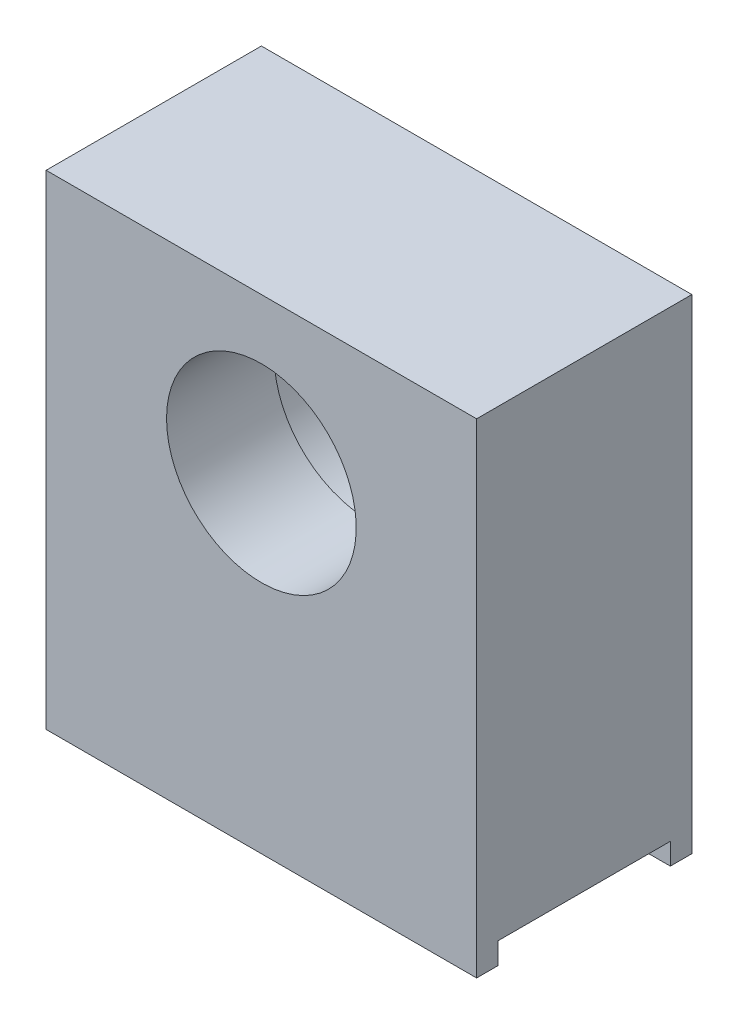
ISO-10303-21;
HEADER;
FILE_DESCRIPTION(('STEP AP214'),'2;1');
FILE_NAME('part.step','',(''),(''),'','','');
FILE_SCHEMA(('AUTOMOTIVE_DESIGN { 1 0 10303 214 1 1 1 1 }'));
ENDSEC;
DATA;
#1=APPLICATION_CONTEXT('core data for automotive mechanical design processes');
#2=APPLICATION_PROTOCOL_DEFINITION('international standard','automotive_design',2000,#1);
#3=PRODUCT_CONTEXT('',#1,'mechanical');
#4=PRODUCT('Part','Part','',(#3));
#5=PRODUCT_RELATED_PRODUCT_CATEGORY('part','',(#4));
#6=PRODUCT_DEFINITION_FORMATION('','',#4);
#7=PRODUCT_DEFINITION_CONTEXT('part definition',#1,'design');
#8=PRODUCT_DEFINITION('design','',#6,#7);
#9=PRODUCT_DEFINITION_SHAPE('','',#8);
#10=(LENGTH_UNIT() NAMED_UNIT(*) SI_UNIT(.MILLI.,.METRE.));
#11=(NAMED_UNIT(*) PLANE_ANGLE_UNIT() SI_UNIT($,.RADIAN.));
#12=(NAMED_UNIT(*) SI_UNIT($,.STERADIAN.) SOLID_ANGLE_UNIT());
#13=UNCERTAINTY_MEASURE_WITH_UNIT(LENGTH_MEASURE(1.E-05),#10,'distance_accuracy_value','');
#14=(GEOMETRIC_REPRESENTATION_CONTEXT(3) GLOBAL_UNCERTAINTY_ASSIGNED_CONTEXT((#13)) GLOBAL_UNIT_ASSIGNED_CONTEXT((#10,
#11,#12)) REPRESENTATION_CONTEXT('',''));
#15=CARTESIAN_POINT('',(0.,0.,0.));
#16=DIRECTION('',(0.,0.,1.));
#17=DIRECTION('',(1.,0.,0.));
#18=AXIS2_PLACEMENT_3D('',#15,#16,#17);
#19=CARTESIAN_POINT('',(1.32515337423313,24.5,9.10429447852761));
#20=DIRECTION('',(0.,0.,-1.));
#21=DIRECTION('',(-1.,0.,0.));
#22=AXIS2_PLACEMENT_3D('',#19,#20,#21);
#23=CYLINDRICAL_SURFACE('',#22,7.05);
#24=CARTESIAN_POINT('',(1.32515337423313,24.5,9.10429447852761));
#25=DIRECTION('',(0.,0.,-1.));
#26=DIRECTION('',(-1.,0.,0.));
#27=AXIS2_PLACEMENT_3D('',#24,#25,#26);
#28=CIRCLE('',#27,7.05);
#29=CARTESIAN_POINT('',(-5.72484662576687,24.5,9.10429447852761));
#30=VERTEX_POINT('',#29);
#31=EDGE_CURVE('E168',#30,#30,#28,.T.);
#32=ORIENTED_EDGE('',*,*,#31,.F.);
#33=EDGE_LOOP('',(#32));
#34=FACE_BOUND('',#33,.T.);
#35=CARTESIAN_POINT('',(1.32515337423313,24.5,1.10429447852761));
#36=DIRECTION('',(0.,0.,-1.));
#37=DIRECTION('',(-1.,0.,0.));
#38=AXIS2_PLACEMENT_3D('',#35,#36,#37);
#39=CIRCLE('',#38,7.05);
#40=CARTESIAN_POINT('',(-5.72484662576687,24.5,1.10429447852761));
#41=VERTEX_POINT('',#40);
#42=EDGE_CURVE('E37',#41,#41,#39,.F.);
#43=ORIENTED_EDGE('',*,*,#42,.F.);
#44=EDGE_LOOP('',(#43));
#45=FACE_BOUND('',#44,.T.);
#46=ADVANCED_FACE('F33',(#34,#45),#23,.F.);
#47=CARTESIAN_POINT('',(0.,0.,0.));
#48=DIRECTION('',(0.,1.,0.));
#49=DIRECTION('',(0.,0.,1.));
#50=AXIS2_PLACEMENT_3D('',#47,#48,#49);
#51=PLANE('',#50);
#52=DIRECTION('',(0.,0.,1.));
#53=VECTOR('',#52,1.);
#54=CARTESIAN_POINT('',(-14.6748466257669,0.,-6.89570552147239));
#55=LINE('',#54,#53);
#56=CARTESIAN_POINT('',(-14.6748466257669,0.,7.50429447852761));
#57=VERTEX_POINT('',#56);
#58=CARTESIAN_POINT('',(-14.6748466257669,0.,9.10429447852761));
#59=VERTEX_POINT('',#58);
#60=EDGE_CURVE('E143',#57,#59,#55,.T.);
#61=ORIENTED_EDGE('',*,*,#60,.F.);
#62=DIRECTION('',(-1.,0.,0.));
#63=VECTOR('',#62,1.);
#64=CARTESIAN_POINT('',(-14.6748466257669,0.,7.50429447852761));
#65=LINE('',#64,#63);
#66=CARTESIAN_POINT('',(17.3251533742331,0.,7.50429447852761));
#67=VERTEX_POINT('',#66);
#68=EDGE_CURVE('E123',#67,#57,#65,.T.);
#69=ORIENTED_EDGE('',*,*,#68,.F.);
#70=DIRECTION('',(0.,0.,-1.));
#71=VECTOR('',#70,1.);
#72=CARTESIAN_POINT('',(17.3251533742331,0.,-6.89570552147239));
#73=LINE('',#72,#71);
#74=CARTESIAN_POINT('',(17.3251533742331,0.,9.10429447852761));
#75=VERTEX_POINT('',#74);
#76=EDGE_CURVE('E146',#75,#67,#73,.T.);
#77=ORIENTED_EDGE('',*,*,#76,.F.);
#78=DIRECTION('',(1.,0.,0.));
#79=VECTOR('',#78,1.);
#80=CARTESIAN_POINT('',(-14.6748466257669,0.,9.10429447852761));
#81=LINE('',#80,#79);
#82=EDGE_CURVE('E142',#59,#75,#81,.T.);
#83=ORIENTED_EDGE('',*,*,#82,.F.);
#84=EDGE_LOOP('',(#61,#69,#77,#83));
#85=FACE_BOUND('',#84,.T.);
#86=ADVANCED_FACE('F164',(#85),#51,.F.);
#87=CARTESIAN_POINT('',(-14.6748466257669,36.,-6.89570552147239));
#88=DIRECTION('',(1.,0.,0.));
#89=DIRECTION('',(0.,0.,-1.));
#90=AXIS2_PLACEMENT_3D('',#87,#88,#89);
#91=PLANE('',#90);
#92=DIRECTION('',(0.,0.,-1.));
#93=VECTOR('',#92,1.);
#94=CARTESIAN_POINT('',(-14.6748466257669,1.6,-5.29570552147239));
#95=LINE('',#94,#93);
#96=CARTESIAN_POINT('',(-14.6748466257669,1.6,7.50429447852761));
#97=VERTEX_POINT('',#96);
#98=CARTESIAN_POINT('',(-14.6748466257669,1.6,-5.29570552147239));
#99=VERTEX_POINT('',#98);
#100=EDGE_CURVE('E114',#97,#99,#95,.T.);
#101=ORIENTED_EDGE('',*,*,#100,.F.);
#102=DIRECTION('',(0.,-1.,0.));
#103=VECTOR('',#102,1.);
#104=CARTESIAN_POINT('',(-14.6748466257669,1.6,7.50429447852761));
#105=LINE('',#104,#103);
#106=EDGE_CURVE('E171',#97,#57,#105,.T.);
#107=ORIENTED_EDGE('',*,*,#106,.T.);
#108=ORIENTED_EDGE('',*,*,#60,.T.);
#109=DIRECTION('',(0.,-1.,0.));
#110=VECTOR('',#109,1.);
#111=CARTESIAN_POINT('',(-14.6748466257669,36.,9.10429447852761));
#112=LINE('',#111,#110);
#113=CARTESIAN_POINT('',(-14.6748466257669,36.,9.10429447852761));
#114=VERTEX_POINT('',#113);
#115=EDGE_CURVE('E11',#114,#59,#112,.T.);
#116=ORIENTED_EDGE('',*,*,#115,.F.);
#117=DIRECTION('',(0.,0.,1.));
#118=VECTOR('',#117,1.);
#119=CARTESIAN_POINT('',(-14.6748466257669,36.,-6.89570552147239));
#120=LINE('',#119,#118);
#121=CARTESIAN_POINT('',(-14.6748466257669,36.,-6.89570552147239));
#122=VERTEX_POINT('',#121);
#123=EDGE_CURVE('E134',#122,#114,#120,.T.);
#124=ORIENTED_EDGE('',*,*,#123,.F.);
#125=DIRECTION('',(0.,-1.,0.));
#126=VECTOR('',#125,1.);
#127=CARTESIAN_POINT('',(-14.6748466257669,36.,-6.89570552147239));
#128=LINE('',#127,#126);
#129=CARTESIAN_POINT('',(-14.6748466257669,0.,-6.89570552147239));
#130=VERTEX_POINT('',#129);
#131=EDGE_CURVE('E140',#122,#130,#128,.T.);
#132=ORIENTED_EDGE('',*,*,#131,.T.);
#133=CARTESIAN_POINT('',(-14.6748466257669,0.,-5.29570552147239));
#134=VERTEX_POINT('',#133);
#135=EDGE_CURVE('E127',#130,#134,#55,.T.);
#136=ORIENTED_EDGE('',*,*,#135,.T.);
#137=DIRECTION('',(0.,-1.,0.));
#138=VECTOR('',#137,1.);
#139=CARTESIAN_POINT('',(-14.6748466257669,1.6,-5.29570552147239));
#140=LINE('',#139,#138);
#141=EDGE_CURVE('E49',#99,#134,#140,.T.);
#142=ORIENTED_EDGE('',*,*,#141,.F.);
#143=EDGE_LOOP('',(#101,#107,#108,#116,#124,#132,#136,#142));
#144=FACE_BOUND('',#143,.T.);
#145=ADVANCED_FACE('F35',(#144),#91,.F.);
#146=CARTESIAN_POINT('',(-14.6748466257669,36.,9.10429447852761));
#147=DIRECTION('',(0.,0.,-1.));
#148=DIRECTION('',(-1.,0.,0.));
#149=AXIS2_PLACEMENT_3D('',#146,#147,#148);
#150=PLANE('',#149);
#151=ORIENTED_EDGE('',*,*,#31,.T.);
#152=EDGE_LOOP('',(#151));
#153=FACE_BOUND('',#152,.T.);
#154=ORIENTED_EDGE('',*,*,#82,.T.);
#155=DIRECTION('',(0.,-1.,0.));
#156=VECTOR('',#155,1.);
#157=CARTESIAN_POINT('',(17.3251533742331,36.,9.10429447852761));
#158=LINE('',#157,#156);
#159=CARTESIAN_POINT('',(17.3251533742331,36.,9.10429447852761));
#160=VERTEX_POINT('',#159);
#161=EDGE_CURVE('E42',#160,#75,#158,.T.);
#162=ORIENTED_EDGE('',*,*,#161,.F.);
#163=DIRECTION('',(1.,0.,0.));
#164=VECTOR('',#163,1.);
#165=CARTESIAN_POINT('',(-14.6748466257669,36.,9.10429447852761));
#166=LINE('',#165,#164);
#167=EDGE_CURVE('E86',#114,#160,#166,.T.);
#168=ORIENTED_EDGE('',*,*,#167,.F.);
#169=ORIENTED_EDGE('',*,*,#115,.T.);
#170=EDGE_LOOP('',(#154,#162,#168,#169));
#171=FACE_BOUND('',#170,.T.);
#172=ADVANCED_FACE('F219',(#153,#171),#150,.F.);
#173=CARTESIAN_POINT('',(17.3251533742331,36.,-6.89570552147239));
#174=DIRECTION('',(-1.,0.,0.));
#175=DIRECTION('',(0.,0.,1.));
#176=AXIS2_PLACEMENT_3D('',#173,#174,#175);
#177=PLANE('',#176);
#178=ORIENTED_EDGE('',*,*,#76,.T.);
#179=DIRECTION('',(0.,-1.,0.));
#180=VECTOR('',#179,1.);
#181=CARTESIAN_POINT('',(17.3251533742331,1.6,7.50429447852761));
#182=LINE('',#181,#180);
#183=CARTESIAN_POINT('',(17.3251533742331,1.6,7.50429447852761));
#184=VERTEX_POINT('',#183);
#185=EDGE_CURVE('E129',#184,#67,#182,.T.);
#186=ORIENTED_EDGE('',*,*,#185,.F.);
#187=DIRECTION('',(0.,0.,1.));
#188=VECTOR('',#187,1.);
#189=CARTESIAN_POINT('',(17.3251533742331,1.6,-5.29570552147239));
#190=LINE('',#189,#188);
#191=CARTESIAN_POINT('',(17.3251533742331,1.6,-5.29570552147239));
#192=VERTEX_POINT('',#191);
#193=EDGE_CURVE('E113',#192,#184,#190,.T.);
#194=ORIENTED_EDGE('',*,*,#193,.F.);
#195=DIRECTION('',(0.,-1.,0.));
#196=VECTOR('',#195,1.);
#197=CARTESIAN_POINT('',(17.3251533742331,1.6,-5.29570552147239));
#198=LINE('',#197,#196);
#199=CARTESIAN_POINT('',(17.3251533742331,0.,-5.29570552147239));
#200=VERTEX_POINT('',#199);
#201=EDGE_CURVE('E110',#192,#200,#198,.T.);
#202=ORIENTED_EDGE('',*,*,#201,.T.);
#203=CARTESIAN_POINT('',(17.3251533742331,0.,-6.89570552147239));
#204=VERTEX_POINT('',#203);
#205=EDGE_CURVE('E145',#200,#204,#73,.T.);
#206=ORIENTED_EDGE('',*,*,#205,.T.);
#207=DIRECTION('',(0.,-1.,0.));
#208=VECTOR('',#207,1.);
#209=CARTESIAN_POINT('',(17.3251533742331,36.,-6.89570552147239));
#210=LINE('',#209,#208);
#211=CARTESIAN_POINT('',(17.3251533742331,36.,-6.89570552147239));
#212=VERTEX_POINT('',#211);
#213=EDGE_CURVE('E151',#212,#204,#210,.T.);
#214=ORIENTED_EDGE('',*,*,#213,.F.);
#215=DIRECTION('',(0.,0.,-1.));
#216=VECTOR('',#215,1.);
#217=CARTESIAN_POINT('',(17.3251533742331,36.,-6.89570552147239));
#218=LINE('',#217,#216);
#219=EDGE_CURVE('E137',#160,#212,#218,.T.);
#220=ORIENTED_EDGE('',*,*,#219,.F.);
#221=ORIENTED_EDGE('',*,*,#161,.T.);
#222=EDGE_LOOP('',(#178,#186,#194,#202,#206,#214,#220,#221));
#223=FACE_BOUND('',#222,.T.);
#224=ADVANCED_FACE('F157',(#223),#177,.F.);
#225=CARTESIAN_POINT('',(-14.6748466257669,36.,-6.89570552147239));
#226=DIRECTION('',(0.,0.,1.));
#227=DIRECTION('',(1.,0.,0.));
#228=AXIS2_PLACEMENT_3D('',#225,#226,#227);
#229=PLANE('',#228);
#230=CARTESIAN_POINT('',(1.32515337423313,24.5,-6.89570552147239));
#231=DIRECTION('',(0.,0.,-1.));
#232=DIRECTION('',(-1.,0.,0.));
#233=AXIS2_PLACEMENT_3D('',#230,#231,#232);
#234=CIRCLE('',#233,7.7);
#235=CARTESIAN_POINT('',(-6.37484662576687,24.5,-6.89570552147239));
#236=VERTEX_POINT('',#235);
#237=EDGE_CURVE('E178',#236,#236,#234,.T.);
#238=ORIENTED_EDGE('',*,*,#237,.F.);
#239=EDGE_LOOP('',(#238));
#240=FACE_BOUND('',#239,.T.);
#241=DIRECTION('',(-1.,0.,0.));
#242=VECTOR('',#241,1.);
#243=CARTESIAN_POINT('',(-14.6748466257669,0.,-6.89570552147239));
#244=LINE('',#243,#242);
#245=EDGE_CURVE('E79',#204,#130,#244,.T.);
#246=ORIENTED_EDGE('',*,*,#245,.T.);
#247=ORIENTED_EDGE('',*,*,#131,.F.);
#248=DIRECTION('',(-1.,0.,0.));
#249=VECTOR('',#248,1.);
#250=CARTESIAN_POINT('',(-14.6748466257669,36.,-6.89570552147239));
#251=LINE('',#250,#249);
#252=EDGE_CURVE('E58',#212,#122,#251,.T.);
#253=ORIENTED_EDGE('',*,*,#252,.F.);
#254=ORIENTED_EDGE('',*,*,#213,.T.);
#255=EDGE_LOOP('',(#246,#247,#253,#254));
#256=FACE_BOUND('',#255,.T.);
#257=ADVANCED_FACE('F211',(#240,#256),#229,.F.);
#258=CARTESIAN_POINT('',(0.,36.,0.));
#259=DIRECTION('',(0.,1.,0.));
#260=DIRECTION('',(0.,0.,1.));
#261=AXIS2_PLACEMENT_3D('',#258,#259,#260);
#262=PLANE('',#261);
#263=ORIENTED_EDGE('',*,*,#123,.T.);
#264=ORIENTED_EDGE('',*,*,#167,.T.);
#265=ORIENTED_EDGE('',*,*,#219,.T.);
#266=ORIENTED_EDGE('',*,*,#252,.T.);
#267=EDGE_LOOP('',(#263,#264,#265,#266));
#268=FACE_BOUND('',#267,.T.);
#269=ADVANCED_FACE('F209',(#268),#262,.T.);
#270=ORIENTED_EDGE('',*,*,#205,.F.);
#271=DIRECTION('',(1.,0.,0.));
#272=VECTOR('',#271,1.);
#273=CARTESIAN_POINT('',(-14.6748466257669,0.,-5.29570552147239));
#274=LINE('',#273,#272);
#275=EDGE_CURVE('E166',#134,#200,#274,.T.);
#276=ORIENTED_EDGE('',*,*,#275,.F.);
#277=ORIENTED_EDGE('',*,*,#135,.F.);
#278=ORIENTED_EDGE('',*,*,#245,.F.);
#279=EDGE_LOOP('',(#270,#276,#277,#278));
#280=FACE_BOUND('',#279,.T.);
#281=ADVANCED_FACE('F197',(#280),#51,.F.);
#282=CARTESIAN_POINT('',(-14.6748466257669,1.6,7.50429447852761));
#283=DIRECTION('',(0.,0.,1.));
#284=DIRECTION('',(1.,0.,0.));
#285=AXIS2_PLACEMENT_3D('',#282,#283,#284);
#286=PLANE('',#285);
#287=ORIENTED_EDGE('',*,*,#68,.T.);
#288=ORIENTED_EDGE('',*,*,#106,.F.);
#289=DIRECTION('',(-1.,0.,0.));
#290=VECTOR('',#289,1.);
#291=CARTESIAN_POINT('',(-14.6748466257669,1.6,7.50429447852761));
#292=LINE('',#291,#290);
#293=EDGE_CURVE('E120',#184,#97,#292,.T.);
#294=ORIENTED_EDGE('',*,*,#293,.F.);
#295=ORIENTED_EDGE('',*,*,#185,.T.);
#296=EDGE_LOOP('',(#287,#288,#294,#295));
#297=FACE_BOUND('',#296,.T.);
#298=ADVANCED_FACE('F172',(#297),#286,.F.);
#299=CARTESIAN_POINT('',(-14.6748466257669,1.6,-5.29570552147239));
#300=DIRECTION('',(0.,0.,-1.));
#301=DIRECTION('',(-1.,0.,0.));
#302=AXIS2_PLACEMENT_3D('',#299,#300,#301);
#303=PLANE('',#302);
#304=ORIENTED_EDGE('',*,*,#275,.T.);
#305=ORIENTED_EDGE('',*,*,#201,.F.);
#306=DIRECTION('',(1.,0.,0.));
#307=VECTOR('',#306,1.);
#308=CARTESIAN_POINT('',(-14.6748466257669,1.6,-5.29570552147239));
#309=LINE('',#308,#307);
#310=EDGE_CURVE('E106',#99,#192,#309,.T.);
#311=ORIENTED_EDGE('',*,*,#310,.F.);
#312=ORIENTED_EDGE('',*,*,#141,.T.);
#313=EDGE_LOOP('',(#304,#305,#311,#312));
#314=FACE_BOUND('',#313,.T.);
#315=ADVANCED_FACE('F108',(#314),#303,.F.);
#316=CARTESIAN_POINT('',(0.,1.6,0.));
#317=DIRECTION('',(0.,1.,0.));
#318=DIRECTION('',(0.,0.,1.));
#319=AXIS2_PLACEMENT_3D('',#316,#317,#318);
#320=PLANE('',#319);
#321=ORIENTED_EDGE('',*,*,#100,.T.);
#322=ORIENTED_EDGE('',*,*,#310,.T.);
#323=ORIENTED_EDGE('',*,*,#193,.T.);
#324=ORIENTED_EDGE('',*,*,#293,.T.);
#325=EDGE_LOOP('',(#321,#322,#323,#324));
#326=FACE_BOUND('',#325,.T.);
#327=ADVANCED_FACE('F118',(#326),#320,.F.);
#328=CARTESIAN_POINT('',(1.32515337423313,24.5,1.10429447852761));
#329=DIRECTION('',(0.,0.,-1.));
#330=DIRECTION('',(-1.,0.,0.));
#331=AXIS2_PLACEMENT_3D('',#328,#329,#330);
#332=PLANE('',#331);
#333=CARTESIAN_POINT('',(1.32515337423313,24.5,1.10429447852761));
#334=DIRECTION('',(0.,0.,-1.));
#335=DIRECTION('',(-1.,0.,0.));
#336=AXIS2_PLACEMENT_3D('',#333,#334,#335);
#337=CIRCLE('',#336,7.7);
#338=CARTESIAN_POINT('',(-6.37484662576687,24.5,1.10429447852761));
#339=VERTEX_POINT('',#338);
#340=EDGE_CURVE('E181',#339,#339,#337,.T.);
#341=ORIENTED_EDGE('',*,*,#340,.T.);
#342=EDGE_LOOP('',(#341));
#343=FACE_BOUND('',#342,.T.);
#344=ORIENTED_EDGE('',*,*,#42,.T.);
#345=EDGE_LOOP('',(#344));
#346=FACE_BOUND('',#345,.T.);
#347=ADVANCED_FACE('F188',(#343,#346),#332,.T.);
#348=CARTESIAN_POINT('',(1.32515337423313,24.5,1.10429447852761));
#349=DIRECTION('',(0.,0.,-1.));
#350=DIRECTION('',(-1.,0.,0.));
#351=AXIS2_PLACEMENT_3D('',#348,#349,#350);
#352=CYLINDRICAL_SURFACE('',#351,7.7);
#353=ORIENTED_EDGE('',*,*,#340,.F.);
#354=EDGE_LOOP('',(#353));
#355=FACE_BOUND('',#354,.T.);
#356=ORIENTED_EDGE('',*,*,#237,.T.);
#357=EDGE_LOOP('',(#356));
#358=FACE_BOUND('',#357,.T.);
#359=ADVANCED_FACE('F201',(#355,#358),#352,.F.);
#360=CLOSED_SHELL('',(#46,#86,#145,#172,#224,#257,#269,#281,#298,#315,#327,#347,#359));
#361=MANIFOLD_SOLID_BREP('B2',#360);
#362=ADVANCED_BREP_SHAPE_REPRESENTATION('',(#18,#361),#14);
#363=SHAPE_DEFINITION_REPRESENTATION(#9,#362);
ENDSEC;
END-ISO-10303-21;
